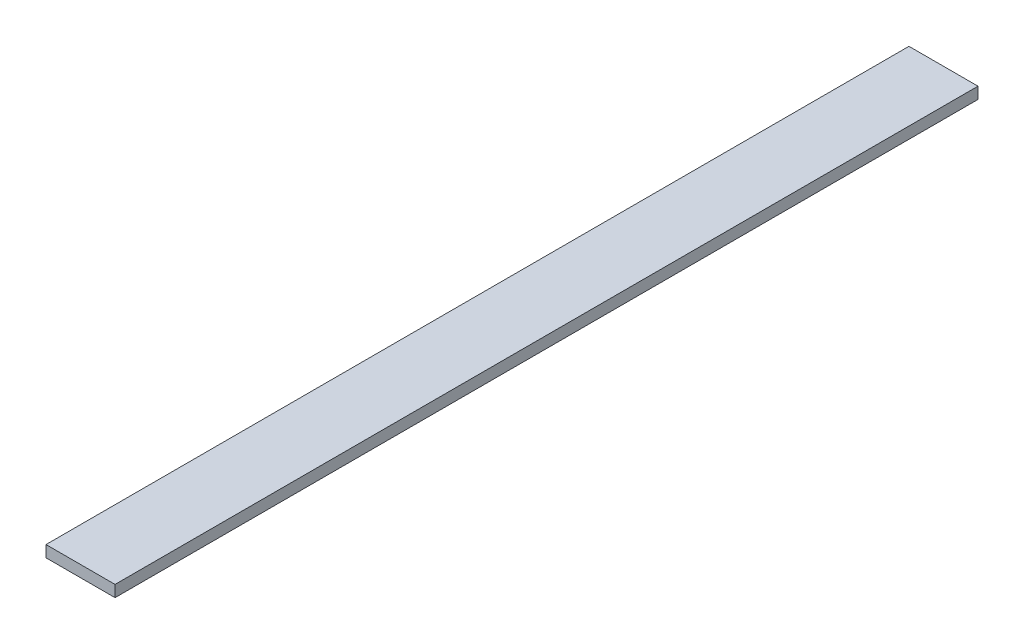
ISO-10303-21;
HEADER;
FILE_DESCRIPTION(('STEP AP214'),'2;1');
FILE_NAME('part.step','',(''),(''),'','','');
FILE_SCHEMA(('AUTOMOTIVE_DESIGN { 1 0 10303 214 1 1 1 1 }'));
ENDSEC;
DATA;
#1=APPLICATION_CONTEXT('core data for automotive mechanical design processes');
#2=APPLICATION_PROTOCOL_DEFINITION('international standard','automotive_design',2000,#1);
#3=PRODUCT_CONTEXT('',#1,'mechanical');
#4=PRODUCT('Part','Part','',(#3));
#5=PRODUCT_RELATED_PRODUCT_CATEGORY('part','',(#4));
#6=PRODUCT_DEFINITION_FORMATION('','',#4);
#7=PRODUCT_DEFINITION_CONTEXT('part definition',#1,'design');
#8=PRODUCT_DEFINITION('design','',#6,#7);
#9=PRODUCT_DEFINITION_SHAPE('','',#8);
#10=(LENGTH_UNIT() NAMED_UNIT(*) SI_UNIT(.MILLI.,.METRE.));
#11=(NAMED_UNIT(*) PLANE_ANGLE_UNIT() SI_UNIT($,.RADIAN.));
#12=(NAMED_UNIT(*) SI_UNIT($,.STERADIAN.) SOLID_ANGLE_UNIT());
#13=UNCERTAINTY_MEASURE_WITH_UNIT(LENGTH_MEASURE(1.E-05),#10,'distance_accuracy_value','');
#14=(GEOMETRIC_REPRESENTATION_CONTEXT(3) GLOBAL_UNCERTAINTY_ASSIGNED_CONTEXT((#13)) GLOBAL_UNIT_ASSIGNED_CONTEXT((#10,
#11,#12)) REPRESENTATION_CONTEXT('',''));
#15=CARTESIAN_POINT('',(0.,0.,0.));
#16=DIRECTION('',(0.,0.,1.));
#17=DIRECTION('',(1.,0.,0.));
#18=AXIS2_PLACEMENT_3D('',#15,#16,#17);
#19=CARTESIAN_POINT('',(0.,8.,0.));
#20=DIRECTION('',(1.,0.,0.));
#21=DIRECTION('',(0.,0.,-1.));
#22=AXIS2_PLACEMENT_3D('',#19,#20,#21);
#23=PLANE('',#22);
#24=DIRECTION('',(0.,0.,1.));
#25=VECTOR('',#24,1.);
#26=CARTESIAN_POINT('',(0.,0.,0.));
#27=LINE('',#26,#25);
#28=CARTESIAN_POINT('',(0.,0.,-600.));
#29=VERTEX_POINT('',#28);
#30=CARTESIAN_POINT('',(0.,0.,0.));
#31=VERTEX_POINT('',#30);
#32=EDGE_CURVE('E107',#29,#31,#27,.T.);
#33=ORIENTED_EDGE('',*,*,#32,.T.);
#34=DIRECTION('',(0.,-1.,0.));
#35=VECTOR('',#34,1.);
#36=CARTESIAN_POINT('',(0.,8.,0.));
#37=LINE('',#36,#35);
#38=CARTESIAN_POINT('',(0.,8.,0.));
#39=VERTEX_POINT('',#38);
#40=EDGE_CURVE('E11',#39,#31,#37,.T.);
#41=ORIENTED_EDGE('',*,*,#40,.F.);
#42=DIRECTION('',(0.,0.,1.));
#43=VECTOR('',#42,1.);
#44=CARTESIAN_POINT('',(0.,8.,0.));
#45=LINE('',#44,#43);
#46=CARTESIAN_POINT('',(0.,8.,-600.));
#47=VERTEX_POINT('',#46);
#48=EDGE_CURVE('E91',#47,#39,#45,.T.);
#49=ORIENTED_EDGE('',*,*,#48,.F.);
#50=DIRECTION('',(0.,-1.,0.));
#51=VECTOR('',#50,1.);
#52=CARTESIAN_POINT('',(0.,8.,-600.));
#53=LINE('',#52,#51);
#54=EDGE_CURVE('E103',#47,#29,#53,.T.);
#55=ORIENTED_EDGE('',*,*,#54,.T.);
#56=EDGE_LOOP('',(#33,#41,#49,#55));
#57=FACE_BOUND('',#56,.T.);
#58=ADVANCED_FACE('F39',(#57),#23,.F.);
#59=CARTESIAN_POINT('',(0.,8.,0.));
#60=DIRECTION('',(0.,0.,-1.));
#61=DIRECTION('',(-1.,0.,0.));
#62=AXIS2_PLACEMENT_3D('',#59,#60,#61);
#63=PLANE('',#62);
#64=DIRECTION('',(1.,0.,0.));
#65=VECTOR('',#64,1.);
#66=CARTESIAN_POINT('',(0.,0.,0.));
#67=LINE('',#66,#65);
#68=CARTESIAN_POINT('',(48.,0.,0.));
#69=VERTEX_POINT('',#68);
#70=EDGE_CURVE('E96',#31,#69,#67,.T.);
#71=ORIENTED_EDGE('',*,*,#70,.T.);
#72=DIRECTION('',(0.,-1.,0.));
#73=VECTOR('',#72,1.);
#74=CARTESIAN_POINT('',(48.,8.,0.));
#75=LINE('',#74,#73);
#76=CARTESIAN_POINT('',(48.,8.,0.));
#77=VERTEX_POINT('',#76);
#78=EDGE_CURVE('E48',#77,#69,#75,.T.);
#79=ORIENTED_EDGE('',*,*,#78,.F.);
#80=DIRECTION('',(1.,0.,0.));
#81=VECTOR('',#80,1.);
#82=CARTESIAN_POINT('',(0.,8.,0.));
#83=LINE('',#82,#81);
#84=EDGE_CURVE('E86',#39,#77,#83,.T.);
#85=ORIENTED_EDGE('',*,*,#84,.F.);
#86=ORIENTED_EDGE('',*,*,#40,.T.);
#87=EDGE_LOOP('',(#71,#79,#85,#86));
#88=FACE_BOUND('',#87,.T.);
#89=ADVANCED_FACE('F95',(#88),#63,.F.);
#90=CARTESIAN_POINT('',(48.,8.,0.));
#91=DIRECTION('',(-1.,0.,0.));
#92=DIRECTION('',(0.,0.,1.));
#93=AXIS2_PLACEMENT_3D('',#90,#91,#92);
#94=PLANE('',#93);
#95=DIRECTION('',(0.,0.,-1.));
#96=VECTOR('',#95,1.);
#97=CARTESIAN_POINT('',(48.,0.,0.));
#98=LINE('',#97,#96);
#99=CARTESIAN_POINT('',(48.,0.,-600.));
#100=VERTEX_POINT('',#99);
#101=EDGE_CURVE('E73',#69,#100,#98,.T.);
#102=ORIENTED_EDGE('',*,*,#101,.T.);
#103=DIRECTION('',(0.,-1.,0.));
#104=VECTOR('',#103,1.);
#105=CARTESIAN_POINT('',(48.,8.,-600.));
#106=LINE('',#105,#104);
#107=CARTESIAN_POINT('',(48.,8.,-600.));
#108=VERTEX_POINT('',#107);
#109=EDGE_CURVE('E98',#108,#100,#106,.T.);
#110=ORIENTED_EDGE('',*,*,#109,.F.);
#111=DIRECTION('',(0.,0.,-1.));
#112=VECTOR('',#111,1.);
#113=CARTESIAN_POINT('',(48.,8.,0.));
#114=LINE('',#113,#112);
#115=EDGE_CURVE('E89',#77,#108,#114,.T.);
#116=ORIENTED_EDGE('',*,*,#115,.F.);
#117=ORIENTED_EDGE('',*,*,#78,.T.);
#118=EDGE_LOOP('',(#102,#110,#116,#117));
#119=FACE_BOUND('',#118,.T.);
#120=ADVANCED_FACE('F99',(#119),#94,.F.);
#121=CARTESIAN_POINT('',(0.,8.,-600.));
#122=DIRECTION('',(0.,0.,1.));
#123=DIRECTION('',(1.,0.,0.));
#124=AXIS2_PLACEMENT_3D('',#121,#122,#123);
#125=PLANE('',#124);
#126=DIRECTION('',(-1.,0.,0.));
#127=VECTOR('',#126,1.);
#128=CARTESIAN_POINT('',(0.,0.,-600.));
#129=LINE('',#128,#127);
#130=EDGE_CURVE('E79',#100,#29,#129,.T.);
#131=ORIENTED_EDGE('',*,*,#130,.T.);
#132=ORIENTED_EDGE('',*,*,#54,.F.);
#133=DIRECTION('',(-1.,0.,0.));
#134=VECTOR('',#133,1.);
#135=CARTESIAN_POINT('',(0.,8.,-600.));
#136=LINE('',#135,#134);
#137=EDGE_CURVE('E56',#108,#47,#136,.T.);
#138=ORIENTED_EDGE('',*,*,#137,.F.);
#139=ORIENTED_EDGE('',*,*,#109,.T.);
#140=EDGE_LOOP('',(#131,#132,#138,#139));
#141=FACE_BOUND('',#140,.T.);
#142=ADVANCED_FACE('F120',(#141),#125,.F.);
#143=CARTESIAN_POINT('',(0.,8.,0.));
#144=DIRECTION('',(0.,-1.,0.));
#145=DIRECTION('',(0.,0.,-1.));
#146=AXIS2_PLACEMENT_3D('',#143,#144,#145);
#147=PLANE('',#146);
#148=ORIENTED_EDGE('',*,*,#48,.T.);
#149=ORIENTED_EDGE('',*,*,#84,.T.);
#150=ORIENTED_EDGE('',*,*,#115,.T.);
#151=ORIENTED_EDGE('',*,*,#137,.T.);
#152=EDGE_LOOP('',(#148,#149,#150,#151));
#153=FACE_BOUND('',#152,.T.);
#154=ADVANCED_FACE('F87',(#153),#147,.F.);
#155=CARTESIAN_POINT('',(0.,0.,0.));
#156=DIRECTION('',(0.,-1.,0.));
#157=DIRECTION('',(0.,0.,-1.));
#158=AXIS2_PLACEMENT_3D('',#155,#156,#157);
#159=PLANE('',#158);
#160=ORIENTED_EDGE('',*,*,#32,.F.);
#161=ORIENTED_EDGE('',*,*,#130,.F.);
#162=ORIENTED_EDGE('',*,*,#101,.F.);
#163=ORIENTED_EDGE('',*,*,#70,.F.);
#164=EDGE_LOOP('',(#160,#161,#162,#163));
#165=FACE_BOUND('',#164,.T.);
#166=ADVANCED_FACE('F123',(#165),#159,.T.);
#167=CLOSED_SHELL('',(#58,#89,#120,#142,#154,#166));
#168=MANIFOLD_SOLID_BREP('B2',#167);
#169=ADVANCED_BREP_SHAPE_REPRESENTATION('',(#18,#168),#14);
#170=SHAPE_DEFINITION_REPRESENTATION(#9,#169);
ENDSEC;
END-ISO-10303-21;
